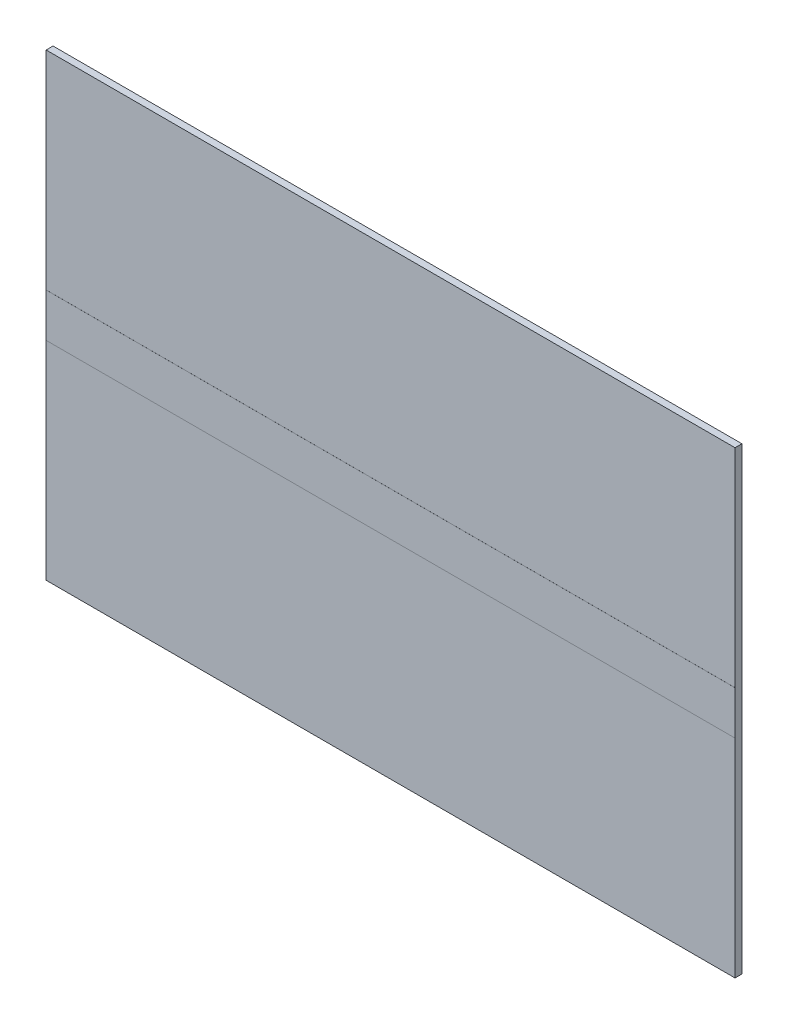
ISO-10303-21;
HEADER;
FILE_DESCRIPTION(('STEP AP214'),'2;1');
FILE_NAME('part.step','',(''),(''),'','','');
FILE_SCHEMA(('AUTOMOTIVE_DESIGN { 1 0 10303 214 1 1 1 1 }'));
ENDSEC;
DATA;
#1=APPLICATION_CONTEXT('core data for automotive mechanical design processes');
#2=APPLICATION_PROTOCOL_DEFINITION('international standard','automotive_design',2000,#1);
#3=PRODUCT_CONTEXT('',#1,'mechanical');
#4=PRODUCT('Part','Part','',(#3));
#5=PRODUCT_RELATED_PRODUCT_CATEGORY('part','',(#4));
#6=PRODUCT_DEFINITION_FORMATION('','',#4);
#7=PRODUCT_DEFINITION_CONTEXT('part definition',#1,'design');
#8=PRODUCT_DEFINITION('design','',#6,#7);
#9=PRODUCT_DEFINITION_SHAPE('','',#8);
#10=(LENGTH_UNIT() NAMED_UNIT(*) SI_UNIT(.MILLI.,.METRE.));
#11=(NAMED_UNIT(*) PLANE_ANGLE_UNIT() SI_UNIT($,.RADIAN.));
#12=(NAMED_UNIT(*) SI_UNIT($,.STERADIAN.) SOLID_ANGLE_UNIT());
#13=UNCERTAINTY_MEASURE_WITH_UNIT(LENGTH_MEASURE(1.E-05),#10,'distance_accuracy_value','');
#14=(GEOMETRIC_REPRESENTATION_CONTEXT(3) GLOBAL_UNCERTAINTY_ASSIGNED_CONTEXT((#13)) GLOBAL_UNIT_ASSIGNED_CONTEXT((#10,
#11,#12)) REPRESENTATION_CONTEXT('',''));
#15=CARTESIAN_POINT('',(0.,0.,0.));
#16=DIRECTION('',(0.,0.,1.));
#17=DIRECTION('',(1.,0.,0.));
#18=AXIS2_PLACEMENT_3D('',#15,#16,#17);
#19=CARTESIAN_POINT('',(0.,0.,3.));
#20=DIRECTION('',(0.,0.,-1.));
#21=DIRECTION('',(-1.,0.,0.));
#22=AXIS2_PLACEMENT_3D('',#19,#20,#21);
#23=PLANE('',#22);
#24=DIRECTION('',(-1.,0.,0.));
#25=VECTOR('',#24,1.);
#26=CARTESIAN_POINT('',(0.,109.5,3.));
#27=LINE('',#26,#25);
#28=CARTESIAN_POINT('',(300.,109.5,3.));
#29=VERTEX_POINT('',#28);
#30=CARTESIAN_POINT('',(0.,109.5,3.));
#31=VERTEX_POINT('',#30);
#32=EDGE_CURVE('E51',#29,#31,#27,.T.);
#33=ORIENTED_EDGE('',*,*,#32,.F.);
#34=DIRECTION('',(0.,1.,0.));
#35=VECTOR('',#34,1.);
#36=CARTESIAN_POINT('',(300.,0.,3.));
#37=LINE('',#36,#35);
#38=CARTESIAN_POINT('',(300.,200.,3.));
#39=VERTEX_POINT('',#38);
#40=EDGE_CURVE('E136',#29,#39,#37,.T.);
#41=ORIENTED_EDGE('',*,*,#40,.T.);
#42=DIRECTION('',(-1.,0.,0.));
#43=VECTOR('',#42,1.);
#44=CARTESIAN_POINT('',(0.,200.,3.));
#45=LINE('',#44,#43);
#46=CARTESIAN_POINT('',(0.,200.,3.));
#47=VERTEX_POINT('',#46);
#48=EDGE_CURVE('E139',#39,#47,#45,.T.);
#49=ORIENTED_EDGE('',*,*,#48,.T.);
#50=DIRECTION('',(0.,-1.,0.));
#51=VECTOR('',#50,1.);
#52=CARTESIAN_POINT('',(0.,0.,3.));
#53=LINE('',#52,#51);
#54=EDGE_CURVE('E132',#47,#31,#53,.T.);
#55=ORIENTED_EDGE('',*,*,#54,.T.);
#56=EDGE_LOOP('',(#33,#41,#49,#55));
#57=FACE_BOUND('',#56,.T.);
#58=ADVANCED_FACE('F36',(#57),#23,.F.);
#59=DIRECTION('',(1.,0.,0.));
#60=VECTOR('',#59,1.);
#61=CARTESIAN_POINT('',(0.,90.5,3.));
#62=LINE('',#61,#60);
#63=CARTESIAN_POINT('',(0.,90.5,3.));
#64=VERTEX_POINT('',#63);
#65=CARTESIAN_POINT('',(300.,90.5,3.));
#66=VERTEX_POINT('',#65);
#67=EDGE_CURVE('E59',#64,#66,#62,.T.);
#68=ORIENTED_EDGE('',*,*,#67,.F.);
#69=CARTESIAN_POINT('',(0.,0.,3.));
#70=VERTEX_POINT('',#69);
#71=EDGE_CURVE('E123',#64,#70,#53,.T.);
#72=ORIENTED_EDGE('',*,*,#71,.T.);
#73=DIRECTION('',(1.,0.,0.));
#74=VECTOR('',#73,1.);
#75=CARTESIAN_POINT('',(0.,0.,3.));
#76=LINE('',#75,#74);
#77=CARTESIAN_POINT('',(300.,0.,3.));
#78=VERTEX_POINT('',#77);
#79=EDGE_CURVE('E134',#70,#78,#76,.T.);
#80=ORIENTED_EDGE('',*,*,#79,.T.);
#81=EDGE_CURVE('E137',#78,#66,#37,.T.);
#82=ORIENTED_EDGE('',*,*,#81,.T.);
#83=EDGE_LOOP('',(#68,#72,#80,#82));
#84=FACE_BOUND('',#83,.T.);
#85=ADVANCED_FACE('F188',(#84),#23,.F.);
#86=CARTESIAN_POINT('',(0.,0.,3.));
#87=DIRECTION('',(1.,0.,0.));
#88=DIRECTION('',(0.,0.,-1.));
#89=AXIS2_PLACEMENT_3D('',#86,#87,#88);
#90=PLANE('',#89);
#91=DIRECTION('',(0.,-1.,0.));
#92=VECTOR('',#91,1.);
#93=CARTESIAN_POINT('',(0.,0.,0.));
#94=LINE('',#93,#92);
#95=CARTESIAN_POINT('',(0.,200.,0.));
#96=VERTEX_POINT('',#95);
#97=CARTESIAN_POINT('',(0.,0.,0.));
#98=VERTEX_POINT('',#97);
#99=EDGE_CURVE('E124',#96,#98,#94,.T.);
#100=ORIENTED_EDGE('',*,*,#99,.T.);
#101=DIRECTION('',(0.,0.,-1.));
#102=VECTOR('',#101,1.);
#103=CARTESIAN_POINT('',(0.,0.,3.));
#104=LINE('',#103,#102);
#105=EDGE_CURVE('E11',#70,#98,#104,.T.);
#106=ORIENTED_EDGE('',*,*,#105,.F.);
#107=ORIENTED_EDGE('',*,*,#71,.F.);
#108=DIRECTION('',(0.,0.,-1.));
#109=VECTOR('',#108,1.);
#110=CARTESIAN_POINT('',(0.,90.5,3.02));
#111=LINE('',#110,#109);
#112=CARTESIAN_POINT('',(0.,90.5,3.02));
#113=VERTEX_POINT('',#112);
#114=EDGE_CURVE('E105',#113,#64,#111,.T.);
#115=ORIENTED_EDGE('',*,*,#114,.F.);
#116=DIRECTION('',(0.,-1.,0.));
#117=VECTOR('',#116,1.);
#118=CARTESIAN_POINT('',(0.,109.5,3.02));
#119=LINE('',#118,#117);
#120=CARTESIAN_POINT('',(0.,109.5,3.02));
#121=VERTEX_POINT('',#120);
#122=EDGE_CURVE('E111',#121,#113,#119,.T.);
#123=ORIENTED_EDGE('',*,*,#122,.F.);
#124=DIRECTION('',(0.,0.,-1.));
#125=VECTOR('',#124,1.);
#126=CARTESIAN_POINT('',(0.,109.5,3.02));
#127=LINE('',#126,#125);
#128=EDGE_CURVE('E169',#121,#31,#127,.T.);
#129=ORIENTED_EDGE('',*,*,#128,.T.);
#130=ORIENTED_EDGE('',*,*,#54,.F.);
#131=DIRECTION('',(0.,0.,-1.));
#132=VECTOR('',#131,1.);
#133=CARTESIAN_POINT('',(0.,200.,3.));
#134=LINE('',#133,#132);
#135=EDGE_CURVE('E140',#47,#96,#134,.T.);
#136=ORIENTED_EDGE('',*,*,#135,.T.);
#137=EDGE_LOOP('',(#100,#106,#107,#115,#123,#129,#130,#136));
#138=FACE_BOUND('',#137,.T.);
#139=ADVANCED_FACE('F38',(#138),#90,.F.);
#140=CARTESIAN_POINT('',(0.,0.,3.));
#141=DIRECTION('',(0.,1.,0.));
#142=DIRECTION('',(0.,0.,1.));
#143=AXIS2_PLACEMENT_3D('',#140,#141,#142);
#144=PLANE('',#143);
#145=DIRECTION('',(1.,0.,0.));
#146=VECTOR('',#145,1.);
#147=CARTESIAN_POINT('',(0.,0.,0.));
#148=LINE('',#147,#146);
#149=CARTESIAN_POINT('',(300.,0.,0.));
#150=VERTEX_POINT('',#149);
#151=EDGE_CURVE('E126',#98,#150,#148,.T.);
#152=ORIENTED_EDGE('',*,*,#151,.T.);
#153=DIRECTION('',(0.,0.,-1.));
#154=VECTOR('',#153,1.);
#155=CARTESIAN_POINT('',(300.,0.,3.));
#156=LINE('',#155,#154);
#157=EDGE_CURVE('E44',#78,#150,#156,.T.);
#158=ORIENTED_EDGE('',*,*,#157,.F.);
#159=ORIENTED_EDGE('',*,*,#79,.F.);
#160=ORIENTED_EDGE('',*,*,#105,.T.);
#161=EDGE_LOOP('',(#152,#158,#159,#160));
#162=FACE_BOUND('',#161,.T.);
#163=ADVANCED_FACE('F199',(#162),#144,.F.);
#164=CARTESIAN_POINT('',(300.,0.,3.));
#165=DIRECTION('',(-1.,0.,0.));
#166=DIRECTION('',(0.,0.,1.));
#167=AXIS2_PLACEMENT_3D('',#164,#165,#166);
#168=PLANE('',#167);
#169=DIRECTION('',(0.,1.,0.));
#170=VECTOR('',#169,1.);
#171=CARTESIAN_POINT('',(300.,0.,0.));
#172=LINE('',#171,#170);
#173=CARTESIAN_POINT('',(300.,200.,0.));
#174=VERTEX_POINT('',#173);
#175=EDGE_CURVE('E143',#150,#174,#172,.T.);
#176=ORIENTED_EDGE('',*,*,#175,.T.);
#177=DIRECTION('',(0.,0.,-1.));
#178=VECTOR('',#177,1.);
#179=CARTESIAN_POINT('',(300.,200.,3.));
#180=LINE('',#179,#178);
#181=EDGE_CURVE('E149',#39,#174,#180,.T.);
#182=ORIENTED_EDGE('',*,*,#181,.F.);
#183=ORIENTED_EDGE('',*,*,#40,.F.);
#184=DIRECTION('',(0.,0.,-1.));
#185=VECTOR('',#184,1.);
#186=CARTESIAN_POINT('',(300.,109.5,3.02));
#187=LINE('',#186,#185);
#188=CARTESIAN_POINT('',(300.,109.5,3.02));
#189=VERTEX_POINT('',#188);
#190=EDGE_CURVE('E128',#189,#29,#187,.T.);
#191=ORIENTED_EDGE('',*,*,#190,.F.);
#192=DIRECTION('',(0.,1.,0.));
#193=VECTOR('',#192,1.);
#194=CARTESIAN_POINT('',(300.,109.5,3.02));
#195=LINE('',#194,#193);
#196=CARTESIAN_POINT('',(300.,90.5,3.02));
#197=VERTEX_POINT('',#196);
#198=EDGE_CURVE('E110',#197,#189,#195,.T.);
#199=ORIENTED_EDGE('',*,*,#198,.F.);
#200=DIRECTION('',(0.,0.,-1.));
#201=VECTOR('',#200,1.);
#202=CARTESIAN_POINT('',(300.,90.5,3.02));
#203=LINE('',#202,#201);
#204=EDGE_CURVE('E107',#197,#66,#203,.T.);
#205=ORIENTED_EDGE('',*,*,#204,.T.);
#206=ORIENTED_EDGE('',*,*,#81,.F.);
#207=ORIENTED_EDGE('',*,*,#157,.T.);
#208=EDGE_LOOP('',(#176,#182,#183,#191,#199,#205,#206,#207));
#209=FACE_BOUND('',#208,.T.);
#210=ADVANCED_FACE('F156',(#209),#168,.F.);
#211=CARTESIAN_POINT('',(0.,200.,3.));
#212=DIRECTION('',(0.,-1.,0.));
#213=DIRECTION('',(0.,0.,-1.));
#214=AXIS2_PLACEMENT_3D('',#211,#212,#213);
#215=PLANE('',#214);
#216=DIRECTION('',(-1.,0.,0.));
#217=VECTOR('',#216,1.);
#218=CARTESIAN_POINT('',(0.,200.,0.));
#219=LINE('',#218,#217);
#220=EDGE_CURVE('E145',#174,#96,#219,.T.);
#221=ORIENTED_EDGE('',*,*,#220,.T.);
#222=ORIENTED_EDGE('',*,*,#135,.F.);
#223=ORIENTED_EDGE('',*,*,#48,.F.);
#224=ORIENTED_EDGE('',*,*,#181,.T.);
#225=EDGE_LOOP('',(#221,#222,#223,#224));
#226=FACE_BOUND('',#225,.T.);
#227=ADVANCED_FACE('F166',(#226),#215,.F.);
#228=CARTESIAN_POINT('',(0.,0.,0.));
#229=DIRECTION('',(0.,0.,-1.));
#230=DIRECTION('',(-1.,0.,0.));
#231=AXIS2_PLACEMENT_3D('',#228,#229,#230);
#232=PLANE('',#231);
#233=ORIENTED_EDGE('',*,*,#99,.F.);
#234=ORIENTED_EDGE('',*,*,#220,.F.);
#235=ORIENTED_EDGE('',*,*,#175,.F.);
#236=ORIENTED_EDGE('',*,*,#151,.F.);
#237=EDGE_LOOP('',(#233,#234,#235,#236));
#238=FACE_BOUND('',#237,.T.);
#239=ADVANCED_FACE('F163',(#238),#232,.T.);
#240=CARTESIAN_POINT('',(0.,90.5,3.02));
#241=DIRECTION('',(0.,1.,0.));
#242=DIRECTION('',(0.,0.,1.));
#243=AXIS2_PLACEMENT_3D('',#240,#241,#242);
#244=PLANE('',#243);
#245=ORIENTED_EDGE('',*,*,#67,.T.);
#246=ORIENTED_EDGE('',*,*,#204,.F.);
#247=DIRECTION('',(1.,0.,0.));
#248=VECTOR('',#247,1.);
#249=CARTESIAN_POINT('',(0.,90.5,3.02));
#250=LINE('',#249,#248);
#251=EDGE_CURVE('E101',#113,#197,#250,.T.);
#252=ORIENTED_EDGE('',*,*,#251,.F.);
#253=ORIENTED_EDGE('',*,*,#114,.T.);
#254=EDGE_LOOP('',(#245,#246,#252,#253));
#255=FACE_BOUND('',#254,.T.);
#256=ADVANCED_FACE('F103',(#255),#244,.F.);
#257=CARTESIAN_POINT('',(0.,109.5,3.02));
#258=DIRECTION('',(0.,-1.,0.));
#259=DIRECTION('',(0.,0.,-1.));
#260=AXIS2_PLACEMENT_3D('',#257,#258,#259);
#261=PLANE('',#260);
#262=ORIENTED_EDGE('',*,*,#32,.T.);
#263=ORIENTED_EDGE('',*,*,#128,.F.);
#264=DIRECTION('',(-1.,0.,0.));
#265=VECTOR('',#264,1.);
#266=CARTESIAN_POINT('',(0.,109.5,3.02));
#267=LINE('',#266,#265);
#268=EDGE_CURVE('E116',#189,#121,#267,.T.);
#269=ORIENTED_EDGE('',*,*,#268,.F.);
#270=ORIENTED_EDGE('',*,*,#190,.T.);
#271=EDGE_LOOP('',(#262,#263,#269,#270));
#272=FACE_BOUND('',#271,.T.);
#273=ADVANCED_FACE('F172',(#272),#261,.F.);
#274=CARTESIAN_POINT('',(0.,0.,3.02));
#275=DIRECTION('',(0.,0.,1.));
#276=DIRECTION('',(1.,0.,0.));
#277=AXIS2_PLACEMENT_3D('',#274,#275,#276);
#278=PLANE('',#277);
#279=ORIENTED_EDGE('',*,*,#122,.T.);
#280=ORIENTED_EDGE('',*,*,#251,.T.);
#281=ORIENTED_EDGE('',*,*,#198,.T.);
#282=ORIENTED_EDGE('',*,*,#268,.T.);
#283=EDGE_LOOP('',(#279,#280,#281,#282));
#284=FACE_BOUND('',#283,.T.);
#285=ADVANCED_FACE('F114',(#284),#278,.T.);
#286=CLOSED_SHELL('',(#58,#85,#139,#163,#210,#227,#239,#256,#273,#285));
#287=MANIFOLD_SOLID_BREP('B2',#286);
#288=ADVANCED_BREP_SHAPE_REPRESENTATION('',(#18,#287),#14);
#289=SHAPE_DEFINITION_REPRESENTATION(#9,#288);
ENDSEC;
END-ISO-10303-21;
